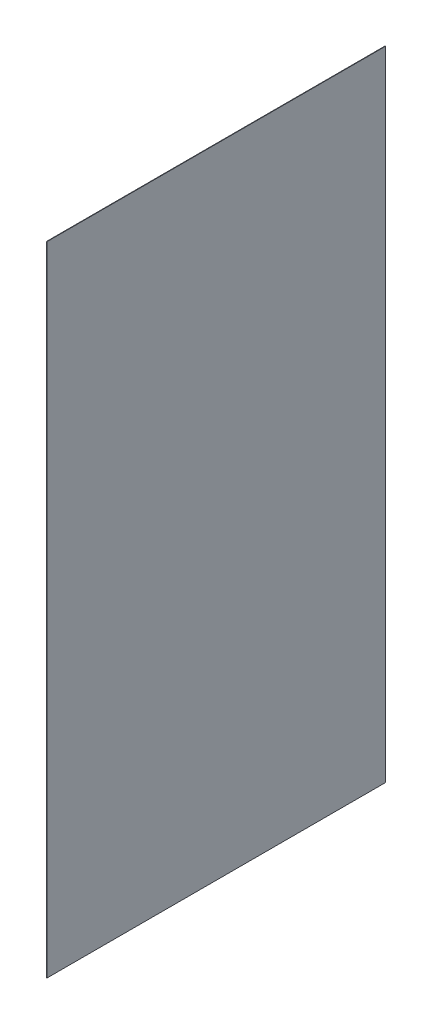
ISO-10303-21;
HEADER;
FILE_DESCRIPTION(('STEP AP214'),'2;1');
FILE_NAME('part.step','',(''),(''),'','','');
FILE_SCHEMA(('AUTOMOTIVE_DESIGN { 1 0 10303 214 1 1 1 1 }'));
ENDSEC;
DATA;
#1=APPLICATION_CONTEXT('core data for automotive mechanical design processes');
#2=APPLICATION_PROTOCOL_DEFINITION('international standard','automotive_design',2000,#1);
#3=PRODUCT_CONTEXT('',#1,'mechanical');
#4=PRODUCT('Part','Part','',(#3));
#5=PRODUCT_RELATED_PRODUCT_CATEGORY('part','',(#4));
#6=PRODUCT_DEFINITION_FORMATION('','',#4);
#7=PRODUCT_DEFINITION_CONTEXT('part definition',#1,'design');
#8=PRODUCT_DEFINITION('design','',#6,#7);
#9=PRODUCT_DEFINITION_SHAPE('','',#8);
#10=(LENGTH_UNIT() NAMED_UNIT(*) SI_UNIT(.MILLI.,.METRE.));
#11=(NAMED_UNIT(*) PLANE_ANGLE_UNIT() SI_UNIT($,.RADIAN.));
#12=(NAMED_UNIT(*) SI_UNIT($,.STERADIAN.) SOLID_ANGLE_UNIT());
#13=UNCERTAINTY_MEASURE_WITH_UNIT(LENGTH_MEASURE(1.E-05),#10,'distance_accuracy_value','');
#14=(GEOMETRIC_REPRESENTATION_CONTEXT(3) GLOBAL_UNCERTAINTY_ASSIGNED_CONTEXT((#13)) GLOBAL_UNIT_ASSIGNED_CONTEXT((#10,
#11,#12)) REPRESENTATION_CONTEXT('',''));
#15=CARTESIAN_POINT('',(0.,0.,0.));
#16=DIRECTION('',(0.,0.,1.));
#17=DIRECTION('',(1.,0.,0.));
#18=AXIS2_PLACEMENT_3D('',#15,#16,#17);
#19=CARTESIAN_POINT('',(690.,182.5,-757.5));
#20=DIRECTION('',(-1.,0.,0.));
#21=DIRECTION('',(0.,0.,1.));
#22=AXIS2_PLACEMENT_3D('',#19,#20,#21);
#23=PLANE('',#22);
#24=DIRECTION('',(0.,-1.,0.));
#25=VECTOR('',#24,1.);
#26=CARTESIAN_POINT('',(690.,182.5,0.));
#27=LINE('',#26,#25);
#28=CARTESIAN_POINT('',(690.,1610.,0.));
#29=VERTEX_POINT('',#28);
#30=CARTESIAN_POINT('',(690.,182.5,0.));
#31=VERTEX_POINT('',#30);
#32=EDGE_CURVE('E103',#29,#31,#27,.T.);
#33=ORIENTED_EDGE('',*,*,#32,.F.);
#34=DIRECTION('',(0.,0.,1.));
#35=VECTOR('',#34,1.);
#36=CARTESIAN_POINT('',(690.,1610.,-757.5));
#37=LINE('',#36,#35);
#38=CARTESIAN_POINT('',(690.,1610.,-757.5));
#39=VERTEX_POINT('',#38);
#40=EDGE_CURVE('E11',#39,#29,#37,.T.);
#41=ORIENTED_EDGE('',*,*,#40,.F.);
#42=DIRECTION('',(0.,-1.,0.));
#43=VECTOR('',#42,1.);
#44=CARTESIAN_POINT('',(690.,182.5,-757.5));
#45=LINE('',#44,#43);
#46=CARTESIAN_POINT('',(690.,182.5,-757.5));
#47=VERTEX_POINT('',#46);
#48=EDGE_CURVE('E97',#39,#47,#45,.T.);
#49=ORIENTED_EDGE('',*,*,#48,.T.);
#50=DIRECTION('',(0.,0.,1.));
#51=VECTOR('',#50,1.);
#52=CARTESIAN_POINT('',(690.,182.5,-757.5));
#53=LINE('',#52,#51);
#54=EDGE_CURVE('E42',#47,#31,#53,.T.);
#55=ORIENTED_EDGE('',*,*,#54,.T.);
#56=EDGE_LOOP('',(#33,#41,#49,#55));
#57=FACE_BOUND('',#56,.T.);
#58=ADVANCED_FACE('F39',(#57),#23,.T.);
#59=CARTESIAN_POINT('',(690.,1610.,-757.5));
#60=DIRECTION('',(0.,1.,0.));
#61=DIRECTION('',(0.,0.,1.));
#62=AXIS2_PLACEMENT_3D('',#59,#60,#61);
#63=PLANE('',#62);
#64=DIRECTION('',(-1.,0.,0.));
#65=VECTOR('',#64,1.);
#66=CARTESIAN_POINT('',(690.,1610.,0.));
#67=LINE('',#66,#65);
#68=CARTESIAN_POINT('',(691.,1610.,0.));
#69=VERTEX_POINT('',#68);
#70=EDGE_CURVE('E99',#69,#29,#67,.T.);
#71=ORIENTED_EDGE('',*,*,#70,.F.);
#72=DIRECTION('',(0.,0.,1.));
#73=VECTOR('',#72,1.);
#74=CARTESIAN_POINT('',(691.,1610.,-757.5));
#75=LINE('',#74,#73);
#76=CARTESIAN_POINT('',(691.,1610.,-757.5));
#77=VERTEX_POINT('',#76);
#78=EDGE_CURVE('E48',#77,#69,#75,.T.);
#79=ORIENTED_EDGE('',*,*,#78,.F.);
#80=DIRECTION('',(-1.,0.,0.));
#81=VECTOR('',#80,1.);
#82=CARTESIAN_POINT('',(690.,1610.,-757.5));
#83=LINE('',#82,#81);
#84=EDGE_CURVE('E94',#77,#39,#83,.T.);
#85=ORIENTED_EDGE('',*,*,#84,.T.);
#86=ORIENTED_EDGE('',*,*,#40,.T.);
#87=EDGE_LOOP('',(#71,#79,#85,#86));
#88=FACE_BOUND('',#87,.T.);
#89=ADVANCED_FACE('F113',(#88),#63,.T.);
#90=CARTESIAN_POINT('',(691.,182.5,-757.5));
#91=DIRECTION('',(1.,0.,0.));
#92=DIRECTION('',(0.,0.,-1.));
#93=AXIS2_PLACEMENT_3D('',#90,#91,#92);
#94=PLANE('',#93);
#95=DIRECTION('',(0.,1.,0.));
#96=VECTOR('',#95,1.);
#97=CARTESIAN_POINT('',(691.,182.5,0.));
#98=LINE('',#97,#96);
#99=CARTESIAN_POINT('',(691.,182.5,0.));
#100=VERTEX_POINT('',#99);
#101=EDGE_CURVE('E89',#100,#69,#98,.T.);
#102=ORIENTED_EDGE('',*,*,#101,.F.);
#103=DIRECTION('',(0.,0.,1.));
#104=VECTOR('',#103,1.);
#105=CARTESIAN_POINT('',(691.,182.5,-757.5));
#106=LINE('',#105,#104);
#107=CARTESIAN_POINT('',(691.,182.5,-757.5));
#108=VERTEX_POINT('',#107);
#109=EDGE_CURVE('E84',#108,#100,#106,.T.);
#110=ORIENTED_EDGE('',*,*,#109,.F.);
#111=DIRECTION('',(0.,1.,0.));
#112=VECTOR('',#111,1.);
#113=CARTESIAN_POINT('',(691.,182.5,-757.5));
#114=LINE('',#113,#112);
#115=EDGE_CURVE('E87',#108,#77,#114,.T.);
#116=ORIENTED_EDGE('',*,*,#115,.T.);
#117=ORIENTED_EDGE('',*,*,#78,.T.);
#118=EDGE_LOOP('',(#102,#110,#116,#117));
#119=FACE_BOUND('',#118,.T.);
#120=ADVANCED_FACE('F86',(#119),#94,.T.);
#121=CARTESIAN_POINT('',(690.,182.5,-757.5));
#122=DIRECTION('',(0.,-1.,0.));
#123=DIRECTION('',(0.,0.,-1.));
#124=AXIS2_PLACEMENT_3D('',#121,#122,#123);
#125=PLANE('',#124);
#126=DIRECTION('',(1.,0.,0.));
#127=VECTOR('',#126,1.);
#128=CARTESIAN_POINT('',(690.,182.5,0.));
#129=LINE('',#128,#127);
#130=EDGE_CURVE('E106',#31,#100,#129,.T.);
#131=ORIENTED_EDGE('',*,*,#130,.F.);
#132=ORIENTED_EDGE('',*,*,#54,.F.);
#133=DIRECTION('',(1.,0.,0.));
#134=VECTOR('',#133,1.);
#135=CARTESIAN_POINT('',(690.,182.5,-757.5));
#136=LINE('',#135,#134);
#137=EDGE_CURVE('E93',#47,#108,#136,.T.);
#138=ORIENTED_EDGE('',*,*,#137,.T.);
#139=ORIENTED_EDGE('',*,*,#109,.T.);
#140=EDGE_LOOP('',(#131,#132,#138,#139));
#141=FACE_BOUND('',#140,.T.);
#142=ADVANCED_FACE('F96',(#141),#125,.T.);
#143=CARTESIAN_POINT('',(0.,0.,-757.5));
#144=DIRECTION('',(0.,0.,-1.));
#145=DIRECTION('',(-1.,0.,0.));
#146=AXIS2_PLACEMENT_3D('',#143,#144,#145);
#147=PLANE('',#146);
#148=ORIENTED_EDGE('',*,*,#48,.F.);
#149=ORIENTED_EDGE('',*,*,#84,.F.);
#150=ORIENTED_EDGE('',*,*,#115,.F.);
#151=ORIENTED_EDGE('',*,*,#137,.F.);
#152=EDGE_LOOP('',(#148,#149,#150,#151));
#153=FACE_BOUND('',#152,.T.);
#154=ADVANCED_FACE('F92',(#153),#147,.T.);
#155=CARTESIAN_POINT('',(0.,0.,0.));
#156=DIRECTION('',(0.,0.,-1.));
#157=DIRECTION('',(-1.,0.,0.));
#158=AXIS2_PLACEMENT_3D('',#155,#156,#157);
#159=PLANE('',#158);
#160=ORIENTED_EDGE('',*,*,#32,.T.);
#161=ORIENTED_EDGE('',*,*,#130,.T.);
#162=ORIENTED_EDGE('',*,*,#101,.T.);
#163=ORIENTED_EDGE('',*,*,#70,.T.);
#164=EDGE_LOOP('',(#160,#161,#162,#163));
#165=FACE_BOUND('',#164,.T.);
#166=ADVANCED_FACE('F112',(#165),#159,.F.);
#167=CLOSED_SHELL('',(#58,#89,#120,#142,#154,#166));
#168=MANIFOLD_SOLID_BREP('B2',#167);
#169=ADVANCED_BREP_SHAPE_REPRESENTATION('',(#18,#168),#14);
#170=SHAPE_DEFINITION_REPRESENTATION(#9,#169);
ENDSEC;
END-ISO-10303-21;
